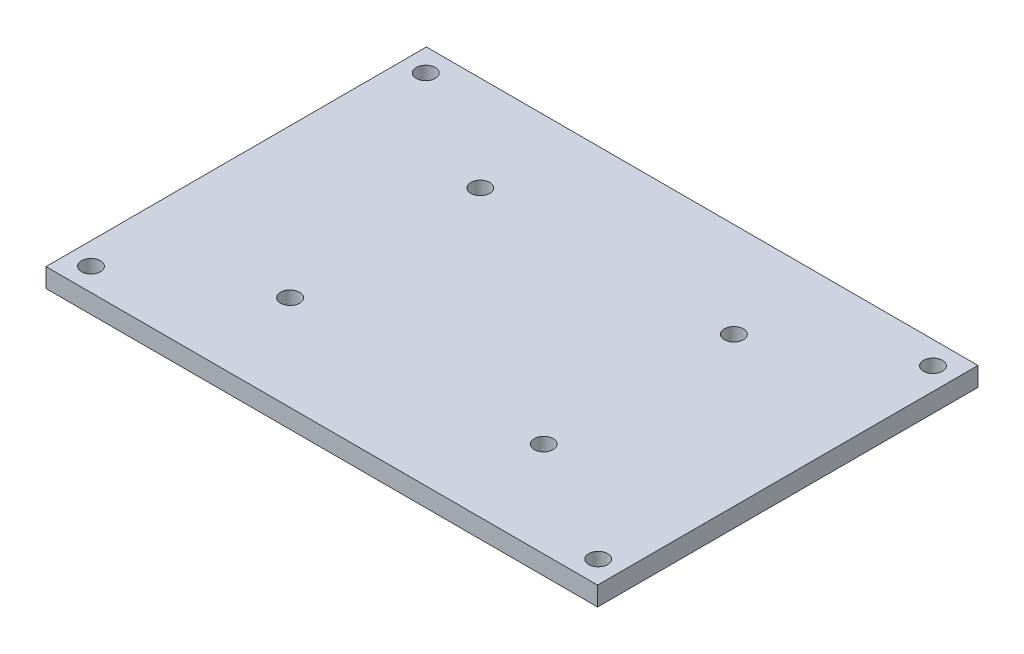
ISO-10303-21;
HEADER;
FILE_DESCRIPTION(('STEP AP214'),'2;1');
FILE_NAME('part.step','',(''),(''),'','','');
FILE_SCHEMA(('AUTOMOTIVE_DESIGN { 1 0 10303 214 1 1 1 1 }'));
ENDSEC;
DATA;
#1=APPLICATION_CONTEXT('core data for automotive mechanical design processes');
#2=APPLICATION_PROTOCOL_DEFINITION('international standard','automotive_design',2000,#1);
#3=PRODUCT_CONTEXT('',#1,'mechanical');
#4=PRODUCT('Part','Part','',(#3));
#5=PRODUCT_RELATED_PRODUCT_CATEGORY('part','',(#4));
#6=PRODUCT_DEFINITION_FORMATION('','',#4);
#7=PRODUCT_DEFINITION_CONTEXT('part definition',#1,'design');
#8=PRODUCT_DEFINITION('design','',#6,#7);
#9=PRODUCT_DEFINITION_SHAPE('','',#8);
#10=(LENGTH_UNIT() NAMED_UNIT(*) SI_UNIT(.MILLI.,.METRE.));
#11=(NAMED_UNIT(*) PLANE_ANGLE_UNIT() SI_UNIT($,.RADIAN.));
#12=(NAMED_UNIT(*) SI_UNIT($,.STERADIAN.) SOLID_ANGLE_UNIT());
#13=UNCERTAINTY_MEASURE_WITH_UNIT(LENGTH_MEASURE(1.E-05),#10,'distance_accuracy_value','');
#14=(GEOMETRIC_REPRESENTATION_CONTEXT(3) GLOBAL_UNCERTAINTY_ASSIGNED_CONTEXT((#13)) GLOBAL_UNIT_ASSIGNED_CONTEXT((#10,
#11,#12)) REPRESENTATION_CONTEXT('',''));
#15=CARTESIAN_POINT('',(0.,0.,0.));
#16=DIRECTION('',(0.,0.,1.));
#17=DIRECTION('',(1.,0.,0.));
#18=AXIS2_PLACEMENT_3D('',#15,#16,#17);
#19=CARTESIAN_POINT('',(43.5,3.,30.));
#20=DIRECTION('',(-1.,0.,0.));
#21=DIRECTION('',(0.,0.,1.));
#22=AXIS2_PLACEMENT_3D('',#19,#20,#21);
#23=PLANE('',#22);
#24=DIRECTION('',(0.,0.,-1.));
#25=VECTOR('',#24,1.);
#26=CARTESIAN_POINT('',(43.5,0.,30.));
#27=LINE('',#26,#25);
#28=CARTESIAN_POINT('',(43.5,0.,30.));
#29=VERTEX_POINT('',#28);
#30=CARTESIAN_POINT('',(43.5,0.,-30.));
#31=VERTEX_POINT('',#30);
#32=EDGE_CURVE('E102',#29,#31,#27,.T.);
#33=ORIENTED_EDGE('',*,*,#32,.T.);
#34=DIRECTION('',(0.,-1.,0.));
#35=VECTOR('',#34,1.);
#36=CARTESIAN_POINT('',(43.5,3.,-30.));
#37=LINE('',#36,#35);
#38=CARTESIAN_POINT('',(43.5,3.,-30.));
#39=VERTEX_POINT('',#38);
#40=EDGE_CURVE('E11',#39,#31,#37,.T.);
#41=ORIENTED_EDGE('',*,*,#40,.F.);
#42=DIRECTION('',(0.,0.,-1.));
#43=VECTOR('',#42,1.);
#44=CARTESIAN_POINT('',(43.5,3.,30.));
#45=LINE('',#44,#43);
#46=CARTESIAN_POINT('',(43.5,3.,30.));
#47=VERTEX_POINT('',#46);
#48=EDGE_CURVE('E95',#47,#39,#45,.T.);
#49=ORIENTED_EDGE('',*,*,#48,.F.);
#50=DIRECTION('',(0.,-1.,0.));
#51=VECTOR('',#50,1.);
#52=CARTESIAN_POINT('',(43.5,3.,30.));
#53=LINE('',#52,#51);
#54=EDGE_CURVE('E99',#47,#29,#53,.T.);
#55=ORIENTED_EDGE('',*,*,#54,.T.);
#56=EDGE_LOOP('',(#33,#41,#49,#55));
#57=FACE_BOUND('',#56,.T.);
#58=ADVANCED_FACE('F41',(#57),#23,.F.);
#59=CARTESIAN_POINT('',(-43.5,3.,-30.));
#60=DIRECTION('',(0.,0.,1.));
#61=DIRECTION('',(1.,0.,0.));
#62=AXIS2_PLACEMENT_3D('',#59,#60,#61);
#63=PLANE('',#62);
#64=DIRECTION('',(-1.,0.,0.));
#65=VECTOR('',#64,1.);
#66=CARTESIAN_POINT('',(-43.5,0.,-30.));
#67=LINE('',#66,#65);
#68=CARTESIAN_POINT('',(-43.5,0.,-30.));
#69=VERTEX_POINT('',#68);
#70=EDGE_CURVE('E96',#31,#69,#67,.T.);
#71=ORIENTED_EDGE('',*,*,#70,.T.);
#72=DIRECTION('',(0.,-1.,0.));
#73=VECTOR('',#72,1.);
#74=CARTESIAN_POINT('',(-43.5,3.,-30.));
#75=LINE('',#74,#73);
#76=CARTESIAN_POINT('',(-43.5,3.,-30.));
#77=VERTEX_POINT('',#76);
#78=EDGE_CURVE('E47',#77,#69,#75,.T.);
#79=ORIENTED_EDGE('',*,*,#78,.F.);
#80=DIRECTION('',(-1.,0.,0.));
#81=VECTOR('',#80,1.);
#82=CARTESIAN_POINT('',(-43.5,3.,-30.));
#83=LINE('',#82,#81);
#84=EDGE_CURVE('E87',#39,#77,#83,.T.);
#85=ORIENTED_EDGE('',*,*,#84,.F.);
#86=ORIENTED_EDGE('',*,*,#40,.T.);
#87=EDGE_LOOP('',(#71,#79,#85,#86));
#88=FACE_BOUND('',#87,.T.);
#89=ADVANCED_FACE('F92',(#88),#63,.F.);
#90=CARTESIAN_POINT('',(-43.5,3.,30.));
#91=DIRECTION('',(1.,0.,0.));
#92=DIRECTION('',(0.,0.,-1.));
#93=AXIS2_PLACEMENT_3D('',#90,#91,#92);
#94=PLANE('',#93);
#95=DIRECTION('',(0.,0.,1.));
#96=VECTOR('',#95,1.);
#97=CARTESIAN_POINT('',(-43.5,0.,30.));
#98=LINE('',#97,#96);
#99=CARTESIAN_POINT('',(-43.5,0.,30.));
#100=VERTEX_POINT('',#99);
#101=EDGE_CURVE('E74',#69,#100,#98,.T.);
#102=ORIENTED_EDGE('',*,*,#101,.T.);
#103=DIRECTION('',(0.,-1.,0.));
#104=VECTOR('',#103,1.);
#105=CARTESIAN_POINT('',(-43.5,3.,30.));
#106=LINE('',#105,#104);
#107=CARTESIAN_POINT('',(-43.5,3.,30.));
#108=VERTEX_POINT('',#107);
#109=EDGE_CURVE('E100',#108,#100,#106,.T.);
#110=ORIENTED_EDGE('',*,*,#109,.F.);
#111=DIRECTION('',(0.,0.,1.));
#112=VECTOR('',#111,1.);
#113=CARTESIAN_POINT('',(-43.5,3.,30.));
#114=LINE('',#113,#112);
#115=EDGE_CURVE('E89',#77,#108,#114,.T.);
#116=ORIENTED_EDGE('',*,*,#115,.F.);
#117=ORIENTED_EDGE('',*,*,#78,.T.);
#118=EDGE_LOOP('',(#102,#110,#116,#117));
#119=FACE_BOUND('',#118,.T.);
#120=ADVANCED_FACE('F98',(#119),#94,.F.);
#121=CARTESIAN_POINT('',(-43.5,3.,30.));
#122=DIRECTION('',(0.,0.,-1.));
#123=DIRECTION('',(-1.,0.,0.));
#124=AXIS2_PLACEMENT_3D('',#121,#122,#123);
#125=PLANE('',#124);
#126=DIRECTION('',(1.,0.,0.));
#127=VECTOR('',#126,1.);
#128=CARTESIAN_POINT('',(-43.5,0.,30.));
#129=LINE('',#128,#127);
#130=EDGE_CURVE('E79',#100,#29,#129,.T.);
#131=ORIENTED_EDGE('',*,*,#130,.T.);
#132=ORIENTED_EDGE('',*,*,#54,.F.);
#133=DIRECTION('',(1.,0.,0.));
#134=VECTOR('',#133,1.);
#135=CARTESIAN_POINT('',(-43.5,3.,30.));
#136=LINE('',#135,#134);
#137=EDGE_CURVE('E60',#108,#47,#136,.T.);
#138=ORIENTED_EDGE('',*,*,#137,.F.);
#139=ORIENTED_EDGE('',*,*,#109,.T.);
#140=EDGE_LOOP('',(#131,#132,#138,#139));
#141=FACE_BOUND('',#140,.T.);
#142=ADVANCED_FACE('F115',(#141),#125,.F.);
#143=CARTESIAN_POINT('',(0.,3.,0.));
#144=DIRECTION('',(0.,-1.,0.));
#145=DIRECTION('',(0.,0.,-1.));
#146=AXIS2_PLACEMENT_3D('',#143,#144,#145);
#147=PLANE('',#146);
#148=CARTESIAN_POINT('',(20.,3.,15.));
#149=DIRECTION('',(0.,1.,0.));
#150=DIRECTION('',(0.,0.,1.));
#151=AXIS2_PLACEMENT_3D('',#148,#149,#150);
#152=CIRCLE('',#151,1.5);
#153=CARTESIAN_POINT('',(20.,3.,16.5));
#154=VERTEX_POINT('',#153);
#155=EDGE_CURVE('E144',#154,#154,#152,.T.);
#156=ORIENTED_EDGE('',*,*,#155,.F.);
#157=EDGE_LOOP('',(#156));
#158=FACE_BOUND('',#157,.T.);
#159=CARTESIAN_POINT('',(-20.,3.,-15.));
#160=DIRECTION('',(0.,1.,0.));
#161=DIRECTION('',(0.,0.,1.));
#162=AXIS2_PLACEMENT_3D('',#159,#160,#161);
#163=CIRCLE('',#162,1.5);
#164=CARTESIAN_POINT('',(-20.,3.,-13.5));
#165=VERTEX_POINT('',#164);
#166=EDGE_CURVE('E151',#165,#165,#163,.T.);
#167=ORIENTED_EDGE('',*,*,#166,.F.);
#168=EDGE_LOOP('',(#167));
#169=FACE_BOUND('',#168,.T.);
#170=CARTESIAN_POINT('',(-20.,3.,15.));
#171=DIRECTION('',(0.,1.,0.));
#172=DIRECTION('',(0.,0.,1.));
#173=AXIS2_PLACEMENT_3D('',#170,#171,#172);
#174=CIRCLE('',#173,1.5);
#175=CARTESIAN_POINT('',(-20.,3.,16.5));
#176=VERTEX_POINT('',#175);
#177=EDGE_CURVE('E155',#176,#176,#174,.T.);
#178=ORIENTED_EDGE('',*,*,#177,.F.);
#179=EDGE_LOOP('',(#178));
#180=FACE_BOUND('',#179,.T.);
#181=CARTESIAN_POINT('',(20.,3.,-15.));
#182=DIRECTION('',(0.,1.,0.));
#183=DIRECTION('',(0.,0.,1.));
#184=AXIS2_PLACEMENT_3D('',#181,#182,#183);
#185=CIRCLE('',#184,1.5);
#186=CARTESIAN_POINT('',(20.,3.,-13.5));
#187=VERTEX_POINT('',#186);
#188=EDGE_CURVE('E142',#187,#187,#185,.T.);
#189=ORIENTED_EDGE('',*,*,#188,.F.);
#190=EDGE_LOOP('',(#189));
#191=FACE_BOUND('',#190,.T.);
#192=CARTESIAN_POINT('',(-40.,3.,26.4));
#193=DIRECTION('',(0.,1.,0.));
#194=DIRECTION('',(0.,0.,1.));
#195=AXIS2_PLACEMENT_3D('',#192,#193,#194);
#196=CIRCLE('',#195,1.5);
#197=CARTESIAN_POINT('',(-40.,3.,27.9));
#198=VERTEX_POINT('',#197);
#199=EDGE_CURVE('E130',#198,#198,#196,.T.);
#200=ORIENTED_EDGE('',*,*,#199,.F.);
#201=EDGE_LOOP('',(#200));
#202=FACE_BOUND('',#201,.T.);
#203=CARTESIAN_POINT('',(40.,3.,26.4));
#204=DIRECTION('',(0.,1.,0.));
#205=DIRECTION('',(0.,0.,1.));
#206=AXIS2_PLACEMENT_3D('',#203,#204,#205);
#207=CIRCLE('',#206,1.5);
#208=CARTESIAN_POINT('',(40.,3.,27.9));
#209=VERTEX_POINT('',#208);
#210=EDGE_CURVE('E132',#209,#209,#207,.T.);
#211=ORIENTED_EDGE('',*,*,#210,.F.);
#212=EDGE_LOOP('',(#211));
#213=FACE_BOUND('',#212,.T.);
#214=CARTESIAN_POINT('',(40.,3.,-26.4));
#215=DIRECTION('',(0.,1.,0.));
#216=DIRECTION('',(0.,0.,1.));
#217=AXIS2_PLACEMENT_3D('',#214,#215,#216);
#218=CIRCLE('',#217,1.5);
#219=CARTESIAN_POINT('',(40.,3.,-24.9));
#220=VERTEX_POINT('',#219);
#221=EDGE_CURVE('E124',#220,#220,#218,.T.);
#222=ORIENTED_EDGE('',*,*,#221,.F.);
#223=EDGE_LOOP('',(#222));
#224=FACE_BOUND('',#223,.T.);
#225=CARTESIAN_POINT('',(-40.,3.,-26.4));
#226=DIRECTION('',(0.,1.,0.));
#227=DIRECTION('',(0.,0.,1.));
#228=AXIS2_PLACEMENT_3D('',#225,#226,#227);
#229=CIRCLE('',#228,1.5);
#230=CARTESIAN_POINT('',(-40.,3.,-24.9));
#231=VERTEX_POINT('',#230);
#232=EDGE_CURVE('E116',#231,#231,#229,.T.);
#233=ORIENTED_EDGE('',*,*,#232,.F.);
#234=EDGE_LOOP('',(#233));
#235=FACE_BOUND('',#234,.T.);
#236=ORIENTED_EDGE('',*,*,#48,.T.);
#237=ORIENTED_EDGE('',*,*,#84,.T.);
#238=ORIENTED_EDGE('',*,*,#115,.T.);
#239=ORIENTED_EDGE('',*,*,#137,.T.);
#240=EDGE_LOOP('',(#236,#237,#238,#239));
#241=FACE_BOUND('',#240,.T.);
#242=ADVANCED_FACE('F86',(#158,#169,#180,#191,#202,#213,#224,#235,#241),#147,.F.);
#243=CARTESIAN_POINT('',(0.,0.,0.));
#244=DIRECTION('',(0.,-1.,0.));
#245=DIRECTION('',(0.,0.,-1.));
#246=AXIS2_PLACEMENT_3D('',#243,#244,#245);
#247=PLANE('',#246);
#248=CARTESIAN_POINT('',(20.,0.,15.));
#249=DIRECTION('',(0.,1.,0.));
#250=DIRECTION('',(0.,0.,1.));
#251=AXIS2_PLACEMENT_3D('',#248,#249,#250);
#252=CIRCLE('',#251,1.5);
#253=CARTESIAN_POINT('',(20.,0.,16.5));
#254=VERTEX_POINT('',#253);
#255=EDGE_CURVE('E154',#254,#254,#252,.T.);
#256=ORIENTED_EDGE('',*,*,#255,.T.);
#257=EDGE_LOOP('',(#256));
#258=FACE_BOUND('',#257,.T.);
#259=CARTESIAN_POINT('',(-20.,0.,-15.));
#260=DIRECTION('',(0.,1.,0.));
#261=DIRECTION('',(0.,0.,1.));
#262=AXIS2_PLACEMENT_3D('',#259,#260,#261);
#263=CIRCLE('',#262,1.5);
#264=CARTESIAN_POINT('',(-20.,0.,-13.5));
#265=VERTEX_POINT('',#264);
#266=EDGE_CURVE('E146',#265,#265,#263,.T.);
#267=ORIENTED_EDGE('',*,*,#266,.T.);
#268=EDGE_LOOP('',(#267));
#269=FACE_BOUND('',#268,.T.);
#270=CARTESIAN_POINT('',(-20.,0.,15.));
#271=DIRECTION('',(0.,1.,0.));
#272=DIRECTION('',(0.,0.,1.));
#273=AXIS2_PLACEMENT_3D('',#270,#271,#272);
#274=CIRCLE('',#273,1.5);
#275=CARTESIAN_POINT('',(-20.,0.,16.5));
#276=VERTEX_POINT('',#275);
#277=EDGE_CURVE('E159',#276,#276,#274,.T.);
#278=ORIENTED_EDGE('',*,*,#277,.T.);
#279=EDGE_LOOP('',(#278));
#280=FACE_BOUND('',#279,.T.);
#281=CARTESIAN_POINT('',(20.,0.,-15.));
#282=DIRECTION('',(0.,1.,0.));
#283=DIRECTION('',(0.,0.,1.));
#284=AXIS2_PLACEMENT_3D('',#281,#282,#283);
#285=CIRCLE('',#284,1.5);
#286=CARTESIAN_POINT('',(20.,0.,-13.5));
#287=VERTEX_POINT('',#286);
#288=EDGE_CURVE('E126',#287,#287,#285,.T.);
#289=ORIENTED_EDGE('',*,*,#288,.T.);
#290=EDGE_LOOP('',(#289));
#291=FACE_BOUND('',#290,.T.);
#292=CARTESIAN_POINT('',(-40.,0.,26.4));
#293=DIRECTION('',(0.,1.,0.));
#294=DIRECTION('',(0.,0.,1.));
#295=AXIS2_PLACEMENT_3D('',#292,#293,#294);
#296=CIRCLE('',#295,1.5);
#297=CARTESIAN_POINT('',(-40.,0.,27.9));
#298=VERTEX_POINT('',#297);
#299=EDGE_CURVE('E123',#298,#298,#296,.T.);
#300=ORIENTED_EDGE('',*,*,#299,.T.);
#301=EDGE_LOOP('',(#300));
#302=FACE_BOUND('',#301,.T.);
#303=CARTESIAN_POINT('',(40.,0.,26.4));
#304=DIRECTION('',(0.,1.,0.));
#305=DIRECTION('',(0.,0.,1.));
#306=AXIS2_PLACEMENT_3D('',#303,#304,#305);
#307=CIRCLE('',#306,1.5);
#308=CARTESIAN_POINT('',(40.,0.,27.9));
#309=VERTEX_POINT('',#308);
#310=EDGE_CURVE('E133',#309,#309,#307,.T.);
#311=ORIENTED_EDGE('',*,*,#310,.T.);
#312=EDGE_LOOP('',(#311));
#313=FACE_BOUND('',#312,.T.);
#314=CARTESIAN_POINT('',(40.,0.,-26.4));
#315=DIRECTION('',(0.,1.,0.));
#316=DIRECTION('',(0.,0.,1.));
#317=AXIS2_PLACEMENT_3D('',#314,#315,#316);
#318=CIRCLE('',#317,1.5);
#319=CARTESIAN_POINT('',(40.,0.,-24.9));
#320=VERTEX_POINT('',#319);
#321=EDGE_CURVE('E136',#320,#320,#318,.T.);
#322=ORIENTED_EDGE('',*,*,#321,.T.);
#323=EDGE_LOOP('',(#322));
#324=FACE_BOUND('',#323,.T.);
#325=CARTESIAN_POINT('',(-40.,0.,-26.4));
#326=DIRECTION('',(0.,1.,0.));
#327=DIRECTION('',(0.,0.,1.));
#328=AXIS2_PLACEMENT_3D('',#325,#326,#327);
#329=CIRCLE('',#328,1.5);
#330=CARTESIAN_POINT('',(-40.,0.,-24.9));
#331=VERTEX_POINT('',#330);
#332=EDGE_CURVE('E110',#331,#331,#329,.T.);
#333=ORIENTED_EDGE('',*,*,#332,.T.);
#334=EDGE_LOOP('',(#333));
#335=FACE_BOUND('',#334,.T.);
#336=ORIENTED_EDGE('',*,*,#32,.F.);
#337=ORIENTED_EDGE('',*,*,#130,.F.);
#338=ORIENTED_EDGE('',*,*,#101,.F.);
#339=ORIENTED_EDGE('',*,*,#70,.F.);
#340=EDGE_LOOP('',(#336,#337,#338,#339));
#341=FACE_BOUND('',#340,.T.);
#342=ADVANCED_FACE('F113',(#258,#269,#280,#291,#302,#313,#324,#335,#341),#247,.T.);
#343=CARTESIAN_POINT('',(-40.,0.,-26.4));
#344=DIRECTION('',(0.,1.,0.));
#345=DIRECTION('',(0.,0.,1.));
#346=AXIS2_PLACEMENT_3D('',#343,#344,#345);
#347=CYLINDRICAL_SURFACE('',#346,1.5);
#348=ORIENTED_EDGE('',*,*,#332,.F.);
#349=EDGE_LOOP('',(#348));
#350=FACE_BOUND('',#349,.T.);
#351=ORIENTED_EDGE('',*,*,#232,.T.);
#352=EDGE_LOOP('',(#351));
#353=FACE_BOUND('',#352,.T.);
#354=ADVANCED_FACE('F185',(#350,#353),#347,.F.);
#355=CARTESIAN_POINT('',(40.,0.,-26.4));
#356=DIRECTION('',(0.,1.,0.));
#357=DIRECTION('',(0.,0.,1.));
#358=AXIS2_PLACEMENT_3D('',#355,#356,#357);
#359=CYLINDRICAL_SURFACE('',#358,1.5);
#360=ORIENTED_EDGE('',*,*,#321,.F.);
#361=EDGE_LOOP('',(#360));
#362=FACE_BOUND('',#361,.T.);
#363=ORIENTED_EDGE('',*,*,#221,.T.);
#364=EDGE_LOOP('',(#363));
#365=FACE_BOUND('',#364,.T.);
#366=ADVANCED_FACE('F184',(#362,#365),#359,.F.);
#367=CARTESIAN_POINT('',(40.,0.,26.4));
#368=DIRECTION('',(0.,1.,0.));
#369=DIRECTION('',(0.,0.,1.));
#370=AXIS2_PLACEMENT_3D('',#367,#368,#369);
#371=CYLINDRICAL_SURFACE('',#370,1.5);
#372=ORIENTED_EDGE('',*,*,#310,.F.);
#373=EDGE_LOOP('',(#372));
#374=FACE_BOUND('',#373,.T.);
#375=ORIENTED_EDGE('',*,*,#210,.T.);
#376=EDGE_LOOP('',(#375));
#377=FACE_BOUND('',#376,.T.);
#378=ADVANCED_FACE('F194',(#374,#377),#371,.F.);
#379=CARTESIAN_POINT('',(-40.,0.,26.4));
#380=DIRECTION('',(0.,1.,0.));
#381=DIRECTION('',(0.,0.,1.));
#382=AXIS2_PLACEMENT_3D('',#379,#380,#381);
#383=CYLINDRICAL_SURFACE('',#382,1.5);
#384=ORIENTED_EDGE('',*,*,#299,.F.);
#385=EDGE_LOOP('',(#384));
#386=FACE_BOUND('',#385,.T.);
#387=ORIENTED_EDGE('',*,*,#199,.T.);
#388=EDGE_LOOP('',(#387));
#389=FACE_BOUND('',#388,.T.);
#390=ADVANCED_FACE('F252',(#386,#389),#383,.F.);
#391=CARTESIAN_POINT('',(20.,0.,-15.));
#392=DIRECTION('',(0.,1.,0.));
#393=DIRECTION('',(0.,0.,1.));
#394=AXIS2_PLACEMENT_3D('',#391,#392,#393);
#395=CYLINDRICAL_SURFACE('',#394,1.5);
#396=ORIENTED_EDGE('',*,*,#288,.F.);
#397=EDGE_LOOP('',(#396));
#398=FACE_BOUND('',#397,.T.);
#399=ORIENTED_EDGE('',*,*,#188,.T.);
#400=EDGE_LOOP('',(#399));
#401=FACE_BOUND('',#400,.T.);
#402=ADVANCED_FACE('F261',(#398,#401),#395,.F.);
#403=CARTESIAN_POINT('',(-20.,0.,15.));
#404=DIRECTION('',(0.,1.,0.));
#405=DIRECTION('',(0.,0.,1.));
#406=AXIS2_PLACEMENT_3D('',#403,#404,#405);
#407=CYLINDRICAL_SURFACE('',#406,1.5);
#408=ORIENTED_EDGE('',*,*,#277,.F.);
#409=EDGE_LOOP('',(#408));
#410=FACE_BOUND('',#409,.T.);
#411=ORIENTED_EDGE('',*,*,#177,.T.);
#412=EDGE_LOOP('',(#411));
#413=FACE_BOUND('',#412,.T.);
#414=ADVANCED_FACE('F167',(#410,#413),#407,.F.);
#415=CARTESIAN_POINT('',(-20.,0.,-15.));
#416=DIRECTION('',(0.,1.,0.));
#417=DIRECTION('',(0.,0.,1.));
#418=AXIS2_PLACEMENT_3D('',#415,#416,#417);
#419=CYLINDRICAL_SURFACE('',#418,1.5);
#420=ORIENTED_EDGE('',*,*,#266,.F.);
#421=EDGE_LOOP('',(#420));
#422=FACE_BOUND('',#421,.T.);
#423=ORIENTED_EDGE('',*,*,#166,.T.);
#424=EDGE_LOOP('',(#423));
#425=FACE_BOUND('',#424,.T.);
#426=ADVANCED_FACE('F280',(#422,#425),#419,.F.);
#427=CARTESIAN_POINT('',(20.,0.,15.));
#428=DIRECTION('',(0.,1.,0.));
#429=DIRECTION('',(0.,0.,1.));
#430=AXIS2_PLACEMENT_3D('',#427,#428,#429);
#431=CYLINDRICAL_SURFACE('',#430,1.5);
#432=ORIENTED_EDGE('',*,*,#255,.F.);
#433=EDGE_LOOP('',(#432));
#434=FACE_BOUND('',#433,.T.);
#435=ORIENTED_EDGE('',*,*,#155,.T.);
#436=EDGE_LOOP('',(#435));
#437=FACE_BOUND('',#436,.T.);
#438=ADVANCED_FACE('F289',(#434,#437),#431,.F.);
#439=CLOSED_SHELL('',(#58,#89,#120,#142,#242,#342,#354,#366,#378,#390,#402,#414,#426,#438));
#440=MANIFOLD_SOLID_BREP('B2',#439);
#441=ADVANCED_BREP_SHAPE_REPRESENTATION('',(#18,#440),#14);
#442=SHAPE_DEFINITION_REPRESENTATION(#9,#441);
ENDSEC;
END-ISO-10303-21;
